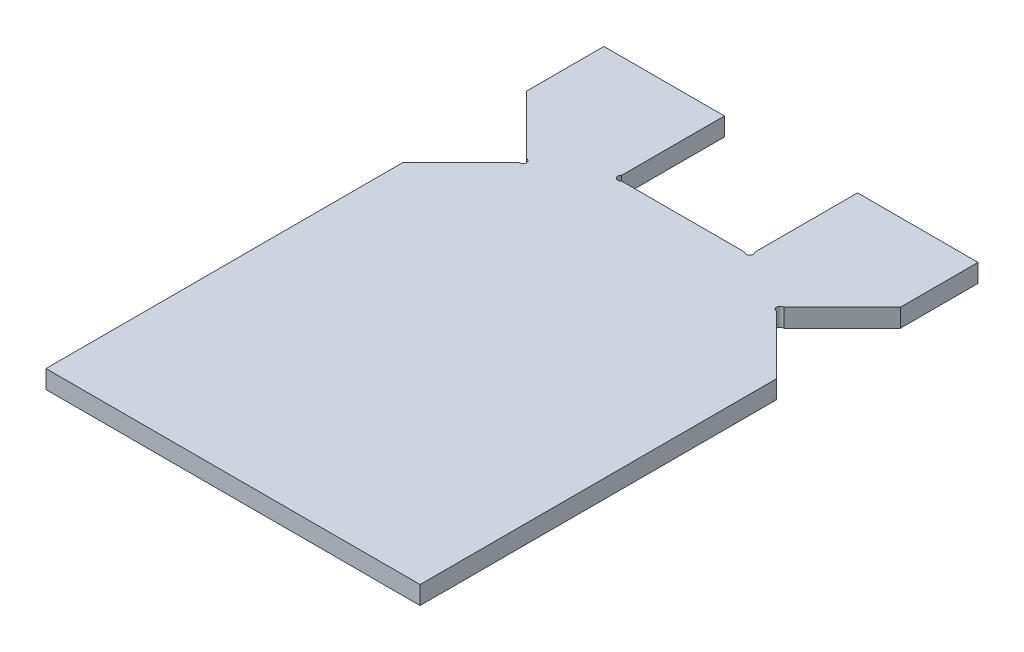
ISO-10303-21;
HEADER;
FILE_DESCRIPTION(('STEP AP214'),'2;1');
FILE_NAME('part.step','',(''),(''),'','','');
FILE_SCHEMA(('AUTOMOTIVE_DESIGN { 1 0 10303 214 1 1 1 1 }'));
ENDSEC;
DATA;
#1=APPLICATION_CONTEXT('core data for automotive mechanical design processes');
#2=APPLICATION_PROTOCOL_DEFINITION('international standard','automotive_design',2000,#1);
#3=PRODUCT_CONTEXT('',#1,'mechanical');
#4=PRODUCT('Part','Part','',(#3));
#5=PRODUCT_RELATED_PRODUCT_CATEGORY('part','',(#4));
#6=PRODUCT_DEFINITION_FORMATION('','',#4);
#7=PRODUCT_DEFINITION_CONTEXT('part definition',#1,'design');
#8=PRODUCT_DEFINITION('design','',#6,#7);
#9=PRODUCT_DEFINITION_SHAPE('','',#8);
#10=(LENGTH_UNIT() NAMED_UNIT(*) SI_UNIT(.MILLI.,.METRE.));
#11=(NAMED_UNIT(*) PLANE_ANGLE_UNIT() SI_UNIT($,.RADIAN.));
#12=(NAMED_UNIT(*) SI_UNIT($,.STERADIAN.) SOLID_ANGLE_UNIT());
#13=UNCERTAINTY_MEASURE_WITH_UNIT(LENGTH_MEASURE(1.E-05),#10,'distance_accuracy_value','');
#14=(GEOMETRIC_REPRESENTATION_CONTEXT(3) GLOBAL_UNCERTAINTY_ASSIGNED_CONTEXT((#13)) GLOBAL_UNIT_ASSIGNED_CONTEXT((#10,
#11,#12)) REPRESENTATION_CONTEXT('',''));
#15=CARTESIAN_POINT('',(0.,0.,0.));
#16=DIRECTION('',(0.,0.,1.));
#17=DIRECTION('',(1.,0.,0.));
#18=AXIS2_PLACEMENT_3D('',#15,#16,#17);
#19=CARTESIAN_POINT('',(-187.325,18.25625,558.8));
#20=DIRECTION('',(1.,0.,0.));
#21=DIRECTION('',(0.,0.,-1.));
#22=AXIS2_PLACEMENT_3D('',#19,#20,#21);
#23=PLANE('',#22);
#24=DIRECTION('',(0.,0.,1.));
#25=VECTOR('',#24,1.);
#26=CARTESIAN_POINT('',(-187.325,0.,558.8));
#27=LINE('',#26,#25);
#28=CARTESIAN_POINT('',(-187.325,0.,0.));
#29=VERTEX_POINT('',#28);
#30=CARTESIAN_POINT('',(-187.325,0.,77.7875));
#31=VERTEX_POINT('',#30);
#32=EDGE_CURVE('E192',#29,#31,#27,.T.);
#33=ORIENTED_EDGE('',*,*,#32,.T.);
#34=DIRECTION('',(0.,1.,0.));
#35=VECTOR('',#34,1.);
#36=CARTESIAN_POINT('',(-187.325,0.,77.7875));
#37=LINE('',#36,#35);
#38=CARTESIAN_POINT('',(-187.325,18.25625,77.7875));
#39=VERTEX_POINT('',#38);
#40=EDGE_CURVE('E191',#31,#39,#37,.T.);
#41=ORIENTED_EDGE('',*,*,#40,.T.);
#42=DIRECTION('',(0.,0.,1.));
#43=VECTOR('',#42,1.);
#44=CARTESIAN_POINT('',(-187.325,18.25625,558.8));
#45=LINE('',#44,#43);
#46=CARTESIAN_POINT('',(-187.325,18.25625,0.));
#47=VERTEX_POINT('',#46);
#48=EDGE_CURVE('E286',#47,#39,#45,.T.);
#49=ORIENTED_EDGE('',*,*,#48,.F.);
#50=DIRECTION('',(0.,-1.,0.));
#51=VECTOR('',#50,1.);
#52=CARTESIAN_POINT('',(-187.325,18.25625,0.));
#53=LINE('',#52,#51);
#54=EDGE_CURVE('E224',#47,#29,#53,.T.);
#55=ORIENTED_EDGE('',*,*,#54,.T.);
#56=EDGE_LOOP('',(#33,#41,#49,#55));
#57=FACE_BOUND('',#56,.T.);
#58=ADVANCED_FACE('F34',(#57),#23,.F.);
#59=CARTESIAN_POINT('',(187.325,18.25625,558.8));
#60=DIRECTION('',(-1.,0.,0.));
#61=DIRECTION('',(0.,0.,1.));
#62=AXIS2_PLACEMENT_3D('',#59,#60,#61);
#63=PLANE('',#62);
#64=DIRECTION('',(0.,0.,-1.));
#65=VECTOR('',#64,1.);
#66=CARTESIAN_POINT('',(187.325,18.25625,558.8));
#67=LINE('',#66,#65);
#68=CARTESIAN_POINT('',(187.325,18.25625,77.7875));
#69=VERTEX_POINT('',#68);
#70=CARTESIAN_POINT('',(187.325,18.25625,0.));
#71=VERTEX_POINT('',#70);
#72=EDGE_CURVE('E291',#69,#71,#67,.T.);
#73=ORIENTED_EDGE('',*,*,#72,.F.);
#74=DIRECTION('',(0.,1.,0.));
#75=VECTOR('',#74,1.);
#76=CARTESIAN_POINT('',(187.325,0.,77.7875));
#77=LINE('',#76,#75);
#78=CARTESIAN_POINT('',(187.325,0.,77.7875));
#79=VERTEX_POINT('',#78);
#80=EDGE_CURVE('E265',#79,#69,#77,.T.);
#81=ORIENTED_EDGE('',*,*,#80,.F.);
#82=DIRECTION('',(0.,0.,-1.));
#83=VECTOR('',#82,1.);
#84=CARTESIAN_POINT('',(187.325,0.,558.8));
#85=LINE('',#84,#83);
#86=CARTESIAN_POINT('',(187.325,0.,0.));
#87=VERTEX_POINT('',#86);
#88=EDGE_CURVE('E197',#79,#87,#85,.T.);
#89=ORIENTED_EDGE('',*,*,#88,.T.);
#90=DIRECTION('',(0.,-1.,0.));
#91=VECTOR('',#90,1.);
#92=CARTESIAN_POINT('',(187.325,18.25625,0.));
#93=LINE('',#92,#91);
#94=EDGE_CURVE('E215',#71,#87,#93,.T.);
#95=ORIENTED_EDGE('',*,*,#94,.F.);
#96=EDGE_LOOP('',(#73,#81,#89,#95));
#97=FACE_BOUND('',#96,.T.);
#98=ADVANCED_FACE('F354',(#97),#63,.F.);
#99=CARTESIAN_POINT('',(-187.325,18.25625,0.));
#100=DIRECTION('',(0.,0.,1.));
#101=DIRECTION('',(1.,0.,0.));
#102=AXIS2_PLACEMENT_3D('',#99,#100,#101);
#103=PLANE('',#102);
#104=DIRECTION('',(-1.,0.,0.));
#105=VECTOR('',#104,1.);
#106=CARTESIAN_POINT('',(-187.325,0.,0.));
#107=LINE('',#106,#105);
#108=CARTESIAN_POINT('',(-66.675,0.,0.));
#109=VERTEX_POINT('',#108);
#110=EDGE_CURVE('E187',#109,#29,#107,.T.);
#111=ORIENTED_EDGE('',*,*,#110,.T.);
#112=ORIENTED_EDGE('',*,*,#54,.F.);
#113=DIRECTION('',(-1.,0.,0.));
#114=VECTOR('',#113,1.);
#115=CARTESIAN_POINT('',(-187.325,18.25625,0.));
#116=LINE('',#115,#114);
#117=CARTESIAN_POINT('',(-66.675,18.25625,0.));
#118=VERTEX_POINT('',#117);
#119=EDGE_CURVE('E209',#118,#47,#116,.T.);
#120=ORIENTED_EDGE('',*,*,#119,.F.);
#121=DIRECTION('',(0.,-1.,0.));
#122=VECTOR('',#121,1.);
#123=CARTESIAN_POINT('',(-66.675,18.25625,0.));
#124=LINE('',#123,#122);
#125=EDGE_CURVE('E181',#118,#109,#124,.T.);
#126=ORIENTED_EDGE('',*,*,#125,.T.);
#127=EDGE_LOOP('',(#111,#112,#120,#126));
#128=FACE_BOUND('',#127,.T.);
#129=ADVANCED_FACE('F36',(#128),#103,.F.);
#130=CARTESIAN_POINT('',(-187.325,18.25625,201.612500000001));
#131=VERTEX_POINT('',#130);
#132=CARTESIAN_POINT('',(-187.325,18.25625,558.8));
#133=VERTEX_POINT('',#132);
#134=EDGE_CURVE('E285',#131,#133,#45,.T.);
#135=ORIENTED_EDGE('',*,*,#134,.F.);
#136=DIRECTION('',(0.,1.,0.));
#137=VECTOR('',#136,1.);
#138=CARTESIAN_POINT('',(-187.325,0.,201.612500000001));
#139=LINE('',#138,#137);
#140=CARTESIAN_POINT('',(-187.325,0.,201.612500000001));
#141=VERTEX_POINT('',#140);
#142=EDGE_CURVE('E262',#141,#131,#139,.T.);
#143=ORIENTED_EDGE('',*,*,#142,.F.);
#144=CARTESIAN_POINT('',(-187.325,0.,558.8));
#145=VERTEX_POINT('',#144);
#146=EDGE_CURVE('E190',#141,#145,#27,.T.);
#147=ORIENTED_EDGE('',*,*,#146,.T.);
#148=DIRECTION('',(0.,-1.,0.));
#149=VECTOR('',#148,1.);
#150=CARTESIAN_POINT('',(-187.325,18.25625,558.8));
#151=LINE('',#150,#149);
#152=EDGE_CURVE('E221',#133,#145,#151,.T.);
#153=ORIENTED_EDGE('',*,*,#152,.F.);
#154=EDGE_LOOP('',(#135,#143,#147,#153));
#155=FACE_BOUND('',#154,.T.);
#156=ADVANCED_FACE('F332',(#155),#23,.F.);
#157=CARTESIAN_POINT('',(-187.325,18.25625,558.8));
#158=DIRECTION('',(0.,0.,-1.));
#159=DIRECTION('',(-1.,0.,0.));
#160=AXIS2_PLACEMENT_3D('',#157,#158,#159);
#161=PLANE('',#160);
#162=DIRECTION('',(1.,0.,0.));
#163=VECTOR('',#162,1.);
#164=CARTESIAN_POINT('',(-187.325,0.,558.8));
#165=LINE('',#164,#163);
#166=CARTESIAN_POINT('',(187.325,0.,558.8));
#167=VERTEX_POINT('',#166);
#168=EDGE_CURVE('E195',#145,#167,#165,.T.);
#169=ORIENTED_EDGE('',*,*,#168,.T.);
#170=DIRECTION('',(0.,-1.,0.));
#171=VECTOR('',#170,1.);
#172=CARTESIAN_POINT('',(187.325,18.25625,558.8));
#173=LINE('',#172,#171);
#174=CARTESIAN_POINT('',(187.325,18.25625,558.8));
#175=VERTEX_POINT('',#174);
#176=EDGE_CURVE('E218',#175,#167,#173,.T.);
#177=ORIENTED_EDGE('',*,*,#176,.F.);
#178=DIRECTION('',(1.,0.,0.));
#179=VECTOR('',#178,1.);
#180=CARTESIAN_POINT('',(-187.325,18.25625,558.8));
#181=LINE('',#180,#179);
#182=EDGE_CURVE('E289',#133,#175,#181,.T.);
#183=ORIENTED_EDGE('',*,*,#182,.F.);
#184=ORIENTED_EDGE('',*,*,#152,.T.);
#185=EDGE_LOOP('',(#169,#177,#183,#184));
#186=FACE_BOUND('',#185,.T.);
#187=ADVANCED_FACE('F339',(#186),#161,.F.);
#188=CARTESIAN_POINT('',(187.325,0.,201.612500000002));
#189=VERTEX_POINT('',#188);
#190=EDGE_CURVE('E198',#167,#189,#85,.T.);
#191=ORIENTED_EDGE('',*,*,#190,.T.);
#192=DIRECTION('',(0.,1.,0.));
#193=VECTOR('',#192,1.);
#194=CARTESIAN_POINT('',(187.325,0.,201.612500000001));
#195=LINE('',#194,#193);
#196=CARTESIAN_POINT('',(187.325,18.25625,201.612500000001));
#197=VERTEX_POINT('',#196);
#198=EDGE_CURVE('E276',#189,#197,#195,.T.);
#199=ORIENTED_EDGE('',*,*,#198,.T.);
#200=EDGE_CURVE('E292',#175,#197,#67,.T.);
#201=ORIENTED_EDGE('',*,*,#200,.F.);
#202=ORIENTED_EDGE('',*,*,#176,.T.);
#203=EDGE_LOOP('',(#191,#199,#201,#202));
#204=FACE_BOUND('',#203,.T.);
#205=ADVANCED_FACE('F342',(#204),#63,.F.);
#206=CARTESIAN_POINT('',(187.325,18.25625,0.));
#207=DIRECTION('',(0.,0.,1.));
#208=DIRECTION('',(1.,0.,0.));
#209=AXIS2_PLACEMENT_3D('',#206,#207,#208);
#210=PLANE('',#209);
#211=DIRECTION('',(-1.,0.,0.));
#212=VECTOR('',#211,1.);
#213=CARTESIAN_POINT('',(187.325,0.,0.));
#214=LINE('',#213,#212);
#215=CARTESIAN_POINT('',(66.675,0.,0.));
#216=VERTEX_POINT('',#215);
#217=EDGE_CURVE('E201',#87,#216,#214,.T.);
#218=ORIENTED_EDGE('',*,*,#217,.T.);
#219=DIRECTION('',(0.,-1.,0.));
#220=VECTOR('',#219,1.);
#221=CARTESIAN_POINT('',(66.675,18.25625,0.));
#222=LINE('',#221,#220);
#223=CARTESIAN_POINT('',(66.675,18.25625,0.));
#224=VERTEX_POINT('',#223);
#225=EDGE_CURVE('E212',#224,#216,#222,.T.);
#226=ORIENTED_EDGE('',*,*,#225,.F.);
#227=DIRECTION('',(-1.,0.,0.));
#228=VECTOR('',#227,1.);
#229=CARTESIAN_POINT('',(187.325,18.25625,0.));
#230=LINE('',#229,#228);
#231=EDGE_CURVE('E183',#71,#224,#230,.T.);
#232=ORIENTED_EDGE('',*,*,#231,.F.);
#233=ORIENTED_EDGE('',*,*,#94,.T.);
#234=EDGE_LOOP('',(#218,#226,#232,#233));
#235=FACE_BOUND('',#234,.T.);
#236=ADVANCED_FACE('F301',(#235),#210,.F.);
#237=CARTESIAN_POINT('',(66.675,18.25625,107.95));
#238=DIRECTION('',(1.,0.,0.));
#239=DIRECTION('',(0.,0.,-1.));
#240=AXIS2_PLACEMENT_3D('',#237,#238,#239);
#241=PLANE('',#240);
#242=DIRECTION('',(0.,0.,1.));
#243=VECTOR('',#242,1.);
#244=CARTESIAN_POINT('',(66.675,0.,107.95));
#245=LINE('',#244,#243);
#246=CARTESIAN_POINT('',(66.675,0.,102.907283566791));
#247=VERTEX_POINT('',#246);
#248=EDGE_CURVE('E203',#216,#247,#245,.T.);
#249=ORIENTED_EDGE('',*,*,#248,.T.);
#250=DIRECTION('',(0.,1.,0.));
#251=VECTOR('',#250,1.);
#252=CARTESIAN_POINT('',(66.675,18.25625,102.907283566791));
#253=LINE('',#252,#251);
#254=CARTESIAN_POINT('',(66.675,18.25625,102.907283566791));
#255=VERTEX_POINT('',#254);
#256=EDGE_CURVE('E38',#247,#255,#253,.T.);
#257=ORIENTED_EDGE('',*,*,#256,.T.);
#258=DIRECTION('',(0.,0.,1.));
#259=VECTOR('',#258,1.);
#260=CARTESIAN_POINT('',(66.675,18.25625,107.95));
#261=LINE('',#260,#259);
#262=EDGE_CURVE('E179',#224,#255,#261,.T.);
#263=ORIENTED_EDGE('',*,*,#262,.F.);
#264=ORIENTED_EDGE('',*,*,#225,.T.);
#265=EDGE_LOOP('',(#249,#257,#263,#264));
#266=FACE_BOUND('',#265,.T.);
#267=ADVANCED_FACE('F305',(#266),#241,.F.);
#268=CARTESIAN_POINT('',(66.675,18.25625,107.95));
#269=DIRECTION('',(0.,0.,1.));
#270=DIRECTION('',(1.,0.,0.));
#271=AXIS2_PLACEMENT_3D('',#268,#269,#270);
#272=PLANE('',#271);
#273=DIRECTION('',(-1.,0.,0.));
#274=VECTOR('',#273,1.);
#275=CARTESIAN_POINT('',(66.675,0.,107.95));
#276=LINE('',#275,#274);
#277=CARTESIAN_POINT('',(61.6322835667907,0.,107.95));
#278=VERTEX_POINT('',#277);
#279=CARTESIAN_POINT('',(-61.6322835667907,0.,107.95));
#280=VERTEX_POINT('',#279);
#281=EDGE_CURVE('E171',#278,#280,#276,.T.);
#282=ORIENTED_EDGE('',*,*,#281,.T.);
#283=DIRECTION('',(0.,1.,0.));
#284=VECTOR('',#283,1.);
#285=CARTESIAN_POINT('',(-61.6322835667907,18.25625,107.95));
#286=LINE('',#285,#284);
#287=CARTESIAN_POINT('',(-61.6322835667907,18.25625,107.95));
#288=VERTEX_POINT('',#287);
#289=EDGE_CURVE('E159',#280,#288,#286,.T.);
#290=ORIENTED_EDGE('',*,*,#289,.T.);
#291=DIRECTION('',(-1.,0.,0.));
#292=VECTOR('',#291,1.);
#293=CARTESIAN_POINT('',(66.675,18.25625,107.95));
#294=LINE('',#293,#292);
#295=CARTESIAN_POINT('',(61.6322835667907,18.25625,107.95));
#296=VERTEX_POINT('',#295);
#297=EDGE_CURVE('E169',#296,#288,#294,.T.);
#298=ORIENTED_EDGE('',*,*,#297,.F.);
#299=DIRECTION('',(0.,1.,0.));
#300=VECTOR('',#299,1.);
#301=CARTESIAN_POINT('',(61.6322835667907,18.25625,107.95));
#302=LINE('',#301,#300);
#303=EDGE_CURVE('E172',#296,#278,#302,.F.);
#304=ORIENTED_EDGE('',*,*,#303,.T.);
#305=EDGE_LOOP('',(#282,#290,#298,#304));
#306=FACE_BOUND('',#305,.T.);
#307=ADVANCED_FACE('F167',(#306),#272,.F.);
#308=CARTESIAN_POINT('',(-66.675,18.25625,107.95));
#309=DIRECTION('',(-1.,0.,0.));
#310=DIRECTION('',(0.,0.,1.));
#311=AXIS2_PLACEMENT_3D('',#308,#309,#310);
#312=PLANE('',#311);
#313=DIRECTION('',(0.,0.,-1.));
#314=VECTOR('',#313,1.);
#315=CARTESIAN_POINT('',(-66.675,18.25625,107.95));
#316=LINE('',#315,#314);
#317=CARTESIAN_POINT('',(-66.675,18.25625,102.907283566791));
#318=VERTEX_POINT('',#317);
#319=EDGE_CURVE('E178',#318,#118,#316,.T.);
#320=ORIENTED_EDGE('',*,*,#319,.F.);
#321=DIRECTION('',(0.,1.,0.));
#322=VECTOR('',#321,1.);
#323=CARTESIAN_POINT('',(-66.675,18.25625,102.907283566791));
#324=LINE('',#323,#322);
#325=CARTESIAN_POINT('',(-66.675,0.,102.907283566791));
#326=VERTEX_POINT('',#325);
#327=EDGE_CURVE('E51',#318,#326,#324,.F.);
#328=ORIENTED_EDGE('',*,*,#327,.T.);
#329=DIRECTION('',(0.,0.,-1.));
#330=VECTOR('',#329,1.);
#331=CARTESIAN_POINT('',(-66.675,0.,107.95));
#332=LINE('',#331,#330);
#333=EDGE_CURVE('E207',#326,#109,#332,.T.);
#334=ORIENTED_EDGE('',*,*,#333,.T.);
#335=ORIENTED_EDGE('',*,*,#125,.F.);
#336=EDGE_LOOP('',(#320,#328,#334,#335));
#337=FACE_BOUND('',#336,.T.);
#338=ADVANCED_FACE('F310',(#337),#312,.F.);
#339=CARTESIAN_POINT('',(0.,18.25625,0.));
#340=DIRECTION('',(0.,1.,0.));
#341=DIRECTION('',(0.,0.,1.));
#342=AXIS2_PLACEMENT_3D('',#339,#340,#341);
#343=PLANE('',#342);
#344=CARTESIAN_POINT('',(-64.29375,18.25625,105.56875));
#345=DIRECTION('',(0.,1.,0.));
#346=DIRECTION('',(0.,0.,1.));
#347=AXIS2_PLACEMENT_3D('',#344,#345,#346);
#348=CIRCLE('',#347,3.57123999999999);
#349=EDGE_CURVE('E43',#318,#288,#348,.T.);
#350=ORIENTED_EDGE('',*,*,#349,.F.);
#351=ORIENTED_EDGE('',*,*,#319,.T.);
#352=ORIENTED_EDGE('',*,*,#119,.T.);
#353=ORIENTED_EDGE('',*,*,#48,.T.);
#354=DIRECTION('',(-0.707106781186552,0.,-0.707106781186543));
#355=VECTOR('',#354,1.);
#356=CARTESIAN_POINT('',(-125.412499999999,18.25625,139.7));
#357=LINE('',#356,#355);
#358=CARTESIAN_POINT('',(-128.978238985522,18.25625,136.134261014477));
#359=VERTEX_POINT('',#358);
#360=EDGE_CURVE('E260',#359,#39,#357,.T.);
#361=ORIENTED_EDGE('',*,*,#360,.F.);
#362=CARTESIAN_POINT('',(-128.7800960454,18.25625,139.7));
#363=DIRECTION('',(0.,1.,0.));
#364=DIRECTION('',(0.,0.,1.));
#365=AXIS2_PLACEMENT_3D('',#362,#363,#364);
#366=CIRCLE('',#365,3.57123999999998);
#367=CARTESIAN_POINT('',(-128.978238985523,18.25625,143.265738985523));
#368=VERTEX_POINT('',#367);
#369=EDGE_CURVE('E236',#368,#359,#366,.T.);
#370=ORIENTED_EDGE('',*,*,#369,.F.);
#371=DIRECTION('',(0.707106781186544,0.,-0.707106781186551));
#372=VECTOR('',#371,1.);
#373=CARTESIAN_POINT('',(-187.325,18.25625,201.612500000001));
#374=LINE('',#373,#372);
#375=EDGE_CURVE('E263',#131,#368,#374,.T.);
#376=ORIENTED_EDGE('',*,*,#375,.F.);
#377=ORIENTED_EDGE('',*,*,#134,.T.);
#378=ORIENTED_EDGE('',*,*,#182,.T.);
#379=ORIENTED_EDGE('',*,*,#200,.T.);
#380=DIRECTION('',(0.707106781186543,0.,0.707106781186552));
#381=VECTOR('',#380,1.);
#382=CARTESIAN_POINT('',(125.412499999999,18.25625,139.7));
#383=LINE('',#382,#381);
#384=CARTESIAN_POINT('',(128.978238985523,18.25625,143.265738985523));
#385=VERTEX_POINT('',#384);
#386=EDGE_CURVE('E274',#385,#197,#383,.T.);
#387=ORIENTED_EDGE('',*,*,#386,.F.);
#388=CARTESIAN_POINT('',(128.7800960454,18.25625,139.7));
#389=DIRECTION('',(0.,1.,0.));
#390=DIRECTION('',(0.,0.,1.));
#391=AXIS2_PLACEMENT_3D('',#388,#389,#390);
#392=CIRCLE('',#391,3.57123999999998);
#393=CARTESIAN_POINT('',(128.978238985522,18.25625,136.134261014477));
#394=VERTEX_POINT('',#393);
#395=EDGE_CURVE('E251',#394,#385,#392,.T.);
#396=ORIENTED_EDGE('',*,*,#395,.F.);
#397=DIRECTION('',(-0.707106781186552,0.,0.707106781186543));
#398=VECTOR('',#397,1.);
#399=CARTESIAN_POINT('',(125.412499999999,18.25625,139.7));
#400=LINE('',#399,#398);
#401=EDGE_CURVE('E256',#69,#394,#400,.T.);
#402=ORIENTED_EDGE('',*,*,#401,.F.);
#403=ORIENTED_EDGE('',*,*,#72,.T.);
#404=ORIENTED_EDGE('',*,*,#231,.T.);
#405=ORIENTED_EDGE('',*,*,#262,.T.);
#406=CARTESIAN_POINT('',(64.29375,18.25625,105.56875));
#407=DIRECTION('',(0.,1.,0.));
#408=DIRECTION('',(0.,0.,1.));
#409=AXIS2_PLACEMENT_3D('',#406,#407,#408);
#410=CIRCLE('',#409,3.57123999999999);
#411=EDGE_CURVE('E177',#296,#255,#410,.T.);
#412=ORIENTED_EDGE('',*,*,#411,.F.);
#413=ORIENTED_EDGE('',*,*,#297,.T.);
#414=EDGE_LOOP('',(#350,#351,#352,#353,#361,#370,#376,#377,#378,#379,#387,#396,#402,#403,#404,
#405,#412,#413));
#415=FACE_BOUND('',#414,.T.);
#416=ADVANCED_FACE('F175',(#415),#343,.T.);
#417=CARTESIAN_POINT('',(0.,0.,0.));
#418=DIRECTION('',(0.,1.,0.));
#419=DIRECTION('',(0.,0.,1.));
#420=AXIS2_PLACEMENT_3D('',#417,#418,#419);
#421=PLANE('',#420);
#422=ORIENTED_EDGE('',*,*,#333,.F.);
#423=CARTESIAN_POINT('',(-64.29375,0.,105.56875));
#424=DIRECTION('',(0.,1.,0.));
#425=DIRECTION('',(0.,0.,1.));
#426=AXIS2_PLACEMENT_3D('',#423,#424,#425);
#427=CIRCLE('',#426,3.57124);
#428=EDGE_CURVE('E11',#326,#280,#427,.T.);
#429=ORIENTED_EDGE('',*,*,#428,.T.);
#430=ORIENTED_EDGE('',*,*,#281,.F.);
#431=CARTESIAN_POINT('',(64.29375,0.,105.56875));
#432=DIRECTION('',(0.,1.,0.));
#433=DIRECTION('',(0.,0.,1.));
#434=AXIS2_PLACEMENT_3D('',#431,#432,#433);
#435=CIRCLE('',#434,3.57123999999999);
#436=EDGE_CURVE('E235',#278,#247,#435,.T.);
#437=ORIENTED_EDGE('',*,*,#436,.T.);
#438=ORIENTED_EDGE('',*,*,#248,.F.);
#439=ORIENTED_EDGE('',*,*,#217,.F.);
#440=ORIENTED_EDGE('',*,*,#88,.F.);
#441=DIRECTION('',(-0.707106781186552,0.,0.707106781186543));
#442=VECTOR('',#441,1.);
#443=CARTESIAN_POINT('',(125.412499999999,0.,139.7));
#444=LINE('',#443,#442);
#445=CARTESIAN_POINT('',(128.978238985522,0.,136.134261014477));
#446=VERTEX_POINT('',#445);
#447=EDGE_CURVE('E270',#79,#446,#444,.T.);
#448=ORIENTED_EDGE('',*,*,#447,.T.);
#449=CARTESIAN_POINT('',(128.7800960454,0.,139.7));
#450=DIRECTION('',(0.,1.,0.));
#451=DIRECTION('',(0.,0.,1.));
#452=AXIS2_PLACEMENT_3D('',#449,#450,#451);
#453=CIRCLE('',#452,3.57123999999999);
#454=CARTESIAN_POINT('',(128.978238985523,0.,143.265738985523));
#455=VERTEX_POINT('',#454);
#456=EDGE_CURVE('E230',#446,#455,#453,.T.);
#457=ORIENTED_EDGE('',*,*,#456,.T.);
#458=DIRECTION('',(0.707106781186543,0.,0.707106781186552));
#459=VECTOR('',#458,1.);
#460=CARTESIAN_POINT('',(125.412499999999,0.,139.7));
#461=LINE('',#460,#459);
#462=EDGE_CURVE('E273',#455,#189,#461,.T.);
#463=ORIENTED_EDGE('',*,*,#462,.T.);
#464=ORIENTED_EDGE('',*,*,#190,.F.);
#465=ORIENTED_EDGE('',*,*,#168,.F.);
#466=ORIENTED_EDGE('',*,*,#146,.F.);
#467=DIRECTION('',(0.707106781186544,0.,-0.707106781186551));
#468=VECTOR('',#467,1.);
#469=CARTESIAN_POINT('',(-187.325,0.,201.612500000001));
#470=LINE('',#469,#468);
#471=CARTESIAN_POINT('',(-128.978238985523,0.,143.265738985523));
#472=VERTEX_POINT('',#471);
#473=EDGE_CURVE('E257',#141,#472,#470,.T.);
#474=ORIENTED_EDGE('',*,*,#473,.T.);
#475=CARTESIAN_POINT('',(-128.7800960454,0.,139.7));
#476=DIRECTION('',(0.,1.,0.));
#477=DIRECTION('',(0.,0.,1.));
#478=AXIS2_PLACEMENT_3D('',#475,#476,#477);
#479=CIRCLE('',#478,3.57124);
#480=CARTESIAN_POINT('',(-128.978238985522,0.,136.134261014477));
#481=VERTEX_POINT('',#480);
#482=EDGE_CURVE('E232',#472,#481,#479,.T.);
#483=ORIENTED_EDGE('',*,*,#482,.T.);
#484=DIRECTION('',(-0.707106781186552,0.,-0.707106781186543));
#485=VECTOR('',#484,1.);
#486=CARTESIAN_POINT('',(-125.412499999999,0.,139.7));
#487=LINE('',#486,#485);
#488=EDGE_CURVE('E259',#481,#31,#487,.T.);
#489=ORIENTED_EDGE('',*,*,#488,.T.);
#490=ORIENTED_EDGE('',*,*,#32,.F.);
#491=ORIENTED_EDGE('',*,*,#110,.F.);
#492=EDGE_LOOP('',(#422,#429,#430,#437,#438,#439,#440,#448,#457,#463,#464,#465,#466,#474,#483,
#489,#490,#491));
#493=FACE_BOUND('',#492,.T.);
#494=ADVANCED_FACE('F314',(#493),#421,.F.);
#495=CARTESIAN_POINT('',(125.412499999999,0.,139.7));
#496=DIRECTION('',(-0.707106781186543,0.,-0.707106781186552));
#497=DIRECTION('',(-0.707106781186552,0.,0.707106781186543));
#498=AXIS2_PLACEMENT_3D('',#495,#496,#497);
#499=PLANE('',#498);
#500=ORIENTED_EDGE('',*,*,#401,.T.);
#501=DIRECTION('',(0.,1.,0.));
#502=VECTOR('',#501,1.);
#503=CARTESIAN_POINT('',(128.978238985522,18.25625,136.134261014477));
#504=LINE('',#503,#502);
#505=EDGE_CURVE('E253',#394,#446,#504,.F.);
#506=ORIENTED_EDGE('',*,*,#505,.T.);
#507=ORIENTED_EDGE('',*,*,#447,.F.);
#508=ORIENTED_EDGE('',*,*,#80,.T.);
#509=EDGE_LOOP('',(#500,#506,#507,#508));
#510=FACE_BOUND('',#509,.T.);
#511=ADVANCED_FACE('F350',(#510),#499,.F.);
#512=CARTESIAN_POINT('',(125.412499999999,0.,139.7));
#513=DIRECTION('',(-0.707106781186552,0.,0.707106781186543));
#514=DIRECTION('',(0.707106781186543,0.,0.707106781186552));
#515=AXIS2_PLACEMENT_3D('',#512,#513,#514);
#516=PLANE('',#515);
#517=ORIENTED_EDGE('',*,*,#462,.F.);
#518=DIRECTION('',(0.,1.,0.));
#519=VECTOR('',#518,1.);
#520=CARTESIAN_POINT('',(128.978238985523,18.25625,143.265738985523));
#521=LINE('',#520,#519);
#522=EDGE_CURVE('E227',#455,#385,#521,.T.);
#523=ORIENTED_EDGE('',*,*,#522,.T.);
#524=ORIENTED_EDGE('',*,*,#386,.T.);
#525=ORIENTED_EDGE('',*,*,#198,.F.);
#526=EDGE_LOOP('',(#517,#523,#524,#525));
#527=FACE_BOUND('',#526,.T.);
#528=ADVANCED_FACE('F346',(#527),#516,.F.);
#529=CARTESIAN_POINT('',(-125.412499999999,0.,139.7));
#530=DIRECTION('',(0.707106781186543,0.,-0.707106781186552));
#531=DIRECTION('',(-0.707106781186552,0.,-0.707106781186543));
#532=AXIS2_PLACEMENT_3D('',#529,#530,#531);
#533=PLANE('',#532);
#534=ORIENTED_EDGE('',*,*,#488,.F.);
#535=DIRECTION('',(0.,1.,0.));
#536=VECTOR('',#535,1.);
#537=CARTESIAN_POINT('',(-128.978238985522,18.25625,136.134261014477));
#538=LINE('',#537,#536);
#539=EDGE_CURVE('E249',#481,#359,#538,.T.);
#540=ORIENTED_EDGE('',*,*,#539,.T.);
#541=ORIENTED_EDGE('',*,*,#360,.T.);
#542=ORIENTED_EDGE('',*,*,#40,.F.);
#543=EDGE_LOOP('',(#534,#540,#541,#542));
#544=FACE_BOUND('',#543,.T.);
#545=ADVANCED_FACE('F323',(#544),#533,.F.);
#546=CARTESIAN_POINT('',(-187.325,0.,201.612500000001));
#547=DIRECTION('',(0.707106781186551,0.,0.707106781186544));
#548=DIRECTION('',(0.707106781186544,0.,-0.707106781186551));
#549=AXIS2_PLACEMENT_3D('',#546,#547,#548);
#550=PLANE('',#549);
#551=ORIENTED_EDGE('',*,*,#375,.T.);
#552=DIRECTION('',(0.,1.,0.));
#553=VECTOR('',#552,1.);
#554=CARTESIAN_POINT('',(-128.978238985523,18.25625,143.265738985523));
#555=LINE('',#554,#553);
#556=EDGE_CURVE('E233',#368,#472,#555,.F.);
#557=ORIENTED_EDGE('',*,*,#556,.T.);
#558=ORIENTED_EDGE('',*,*,#473,.F.);
#559=ORIENTED_EDGE('',*,*,#142,.T.);
#560=EDGE_LOOP('',(#551,#557,#558,#559));
#561=FACE_BOUND('',#560,.T.);
#562=ADVANCED_FACE('F328',(#561),#550,.F.);
#563=CARTESIAN_POINT('',(128.7800960454,18.25625,139.7));
#564=DIRECTION('',(0.,1.,0.));
#565=DIRECTION('',(0.,0.,1.));
#566=AXIS2_PLACEMENT_3D('',#563,#564,#565);
#567=CYLINDRICAL_SURFACE('',#566,3.57123999999999);
#568=ORIENTED_EDGE('',*,*,#456,.F.);
#569=ORIENTED_EDGE('',*,*,#505,.F.);
#570=ORIENTED_EDGE('',*,*,#395,.T.);
#571=ORIENTED_EDGE('',*,*,#522,.F.);
#572=EDGE_LOOP('',(#568,#569,#570,#571));
#573=FACE_BOUND('',#572,.T.);
#574=ADVANCED_FACE('F363',(#573),#567,.F.);
#575=CARTESIAN_POINT('',(-128.7800960454,18.25625,139.7));
#576=DIRECTION('',(0.,1.,0.));
#577=DIRECTION('',(0.,0.,1.));
#578=AXIS2_PLACEMENT_3D('',#575,#576,#577);
#579=CYLINDRICAL_SURFACE('',#578,3.57123999999999);
#580=ORIENTED_EDGE('',*,*,#482,.F.);
#581=ORIENTED_EDGE('',*,*,#556,.F.);
#582=ORIENTED_EDGE('',*,*,#369,.T.);
#583=ORIENTED_EDGE('',*,*,#539,.F.);
#584=EDGE_LOOP('',(#580,#581,#582,#583));
#585=FACE_BOUND('',#584,.T.);
#586=ADVANCED_FACE('F324',(#585),#579,.F.);
#587=CARTESIAN_POINT('',(64.29375,18.25625,105.56875));
#588=DIRECTION('',(0.,1.,0.));
#589=DIRECTION('',(0.,0.,1.));
#590=AXIS2_PLACEMENT_3D('',#587,#588,#589);
#591=CYLINDRICAL_SURFACE('',#590,3.57123999999999);
#592=ORIENTED_EDGE('',*,*,#411,.T.);
#593=ORIENTED_EDGE('',*,*,#256,.F.);
#594=ORIENTED_EDGE('',*,*,#436,.F.);
#595=ORIENTED_EDGE('',*,*,#303,.F.);
#596=EDGE_LOOP('',(#592,#593,#594,#595));
#597=FACE_BOUND('',#596,.T.);
#598=ADVANCED_FACE('F355',(#597),#591,.F.);
#599=CARTESIAN_POINT('',(-64.29375,18.25625,105.56875));
#600=DIRECTION('',(0.,1.,0.));
#601=DIRECTION('',(0.,0.,1.));
#602=AXIS2_PLACEMENT_3D('',#599,#600,#601);
#603=CYLINDRICAL_SURFACE('',#602,3.57123999999999);
#604=ORIENTED_EDGE('',*,*,#428,.F.);
#605=ORIENTED_EDGE('',*,*,#327,.F.);
#606=ORIENTED_EDGE('',*,*,#349,.T.);
#607=ORIENTED_EDGE('',*,*,#289,.F.);
#608=EDGE_LOOP('',(#604,#605,#606,#607));
#609=FACE_BOUND('',#608,.T.);
#610=ADVANCED_FACE('F158',(#609),#603,.F.);
#611=CLOSED_SHELL('',(#58,#98,#129,#156,#187,#205,#236,#267,#307,#338,#416,#494,#511,#528,#545,
#562,#574,#586,#598,#610));
#612=MANIFOLD_SOLID_BREP('B2',#611);
#613=ADVANCED_BREP_SHAPE_REPRESENTATION('',(#18,#612),#14);
#614=SHAPE_DEFINITION_REPRESENTATION(#9,#613);
ENDSEC;
END-ISO-10303-21;
